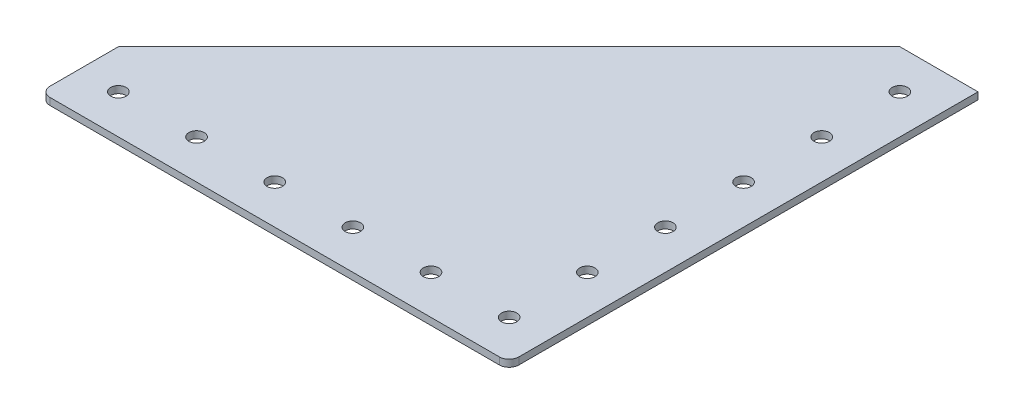
ISO-10303-21;
HEADER;
FILE_DESCRIPTION(('STEP AP214'),'2;1');
FILE_NAME('part.step','',(''),(''),'','','');
FILE_SCHEMA(('AUTOMOTIVE_DESIGN { 1 0 10303 214 1 1 1 1 }'));
ENDSEC;
DATA;
#1=APPLICATION_CONTEXT('core data for automotive mechanical design processes');
#2=APPLICATION_PROTOCOL_DEFINITION('international standard','automotive_design',2000,#1);
#3=PRODUCT_CONTEXT('',#1,'mechanical');
#4=PRODUCT('Part','Part','',(#3));
#5=PRODUCT_RELATED_PRODUCT_CATEGORY('part','',(#4));
#6=PRODUCT_DEFINITION_FORMATION('','',#4);
#7=PRODUCT_DEFINITION_CONTEXT('part definition',#1,'design');
#8=PRODUCT_DEFINITION('design','',#6,#7);
#9=PRODUCT_DEFINITION_SHAPE('','',#8);
#10=(LENGTH_UNIT() NAMED_UNIT(*) SI_UNIT(.MILLI.,.METRE.));
#11=(NAMED_UNIT(*) PLANE_ANGLE_UNIT() SI_UNIT($,.RADIAN.));
#12=(NAMED_UNIT(*) SI_UNIT($,.STERADIAN.) SOLID_ANGLE_UNIT());
#13=UNCERTAINTY_MEASURE_WITH_UNIT(LENGTH_MEASURE(1.E-05),#10,'distance_accuracy_value','');
#14=(GEOMETRIC_REPRESENTATION_CONTEXT(3) GLOBAL_UNCERTAINTY_ASSIGNED_CONTEXT((#13)) GLOBAL_UNIT_ASSIGNED_CONTEXT((#10,
#11,#12)) REPRESENTATION_CONTEXT('',''));
#15=CARTESIAN_POINT('',(0.,0.,0.));
#16=DIRECTION('',(0.,0.,1.));
#17=DIRECTION('',(1.,0.,0.));
#18=AXIS2_PLACEMENT_3D('',#15,#16,#17);
#19=CARTESIAN_POINT('',(0.,1.143,0.));
#20=DIRECTION('',(0.,1.,0.));
#21=DIRECTION('',(0.,0.,1.));
#22=AXIS2_PLACEMENT_3D('',#19,#20,#21);
#23=PLANE('',#22);
#24=CARTESIAN_POINT('',(-139.7,1.143,-12.6999999999921));
#25=DIRECTION('',(0.,1.,0.));
#26=DIRECTION('',(0.,0.,1.));
#27=AXIS2_PLACEMENT_3D('',#24,#25,#26);
#28=CIRCLE('',#27,2.48920000000049);
#29=CARTESIAN_POINT('',(-139.7,1.143,-10.2107999999916));
#30=VERTEX_POINT('',#29);
#31=EDGE_CURVE('E353',#30,#30,#28,.T.);
#32=ORIENTED_EDGE('',*,*,#31,.F.);
#33=EDGE_LOOP('',(#32));
#34=FACE_BOUND('',#33,.T.);
#35=CARTESIAN_POINT('',(-12.7000000000003,1.143,-88.9));
#36=DIRECTION('',(0.,1.,0.));
#37=DIRECTION('',(0.,0.,1.));
#38=AXIS2_PLACEMENT_3D('',#35,#36,#37);
#39=CIRCLE('',#38,2.48919999999999);
#40=CARTESIAN_POINT('',(-12.7000000000003,1.143,-86.4108));
#41=VERTEX_POINT('',#40);
#42=EDGE_CURVE('E372',#41,#41,#39,.T.);
#43=ORIENTED_EDGE('',*,*,#42,.F.);
#44=EDGE_LOOP('',(#43));
#45=FACE_BOUND('',#44,.T.);
#46=CARTESIAN_POINT('',(-12.7000000000001,1.143,-38.1));
#47=DIRECTION('',(0.,1.,0.));
#48=DIRECTION('',(0.,0.,1.));
#49=AXIS2_PLACEMENT_3D('',#46,#47,#48);
#50=CIRCLE('',#49,2.48920000000001);
#51=CARTESIAN_POINT('',(-12.7000000000001,1.143,-35.6108));
#52=VERTEX_POINT('',#51);
#53=EDGE_CURVE('E384',#52,#52,#50,.T.);
#54=ORIENTED_EDGE('',*,*,#53,.F.);
#55=EDGE_LOOP('',(#54));
#56=FACE_BOUND('',#55,.T.);
#57=CARTESIAN_POINT('',(-88.9,1.143,-12.6999999999963));
#58=DIRECTION('',(0.,1.,0.));
#59=DIRECTION('',(0.,0.,1.));
#60=AXIS2_PLACEMENT_3D('',#57,#58,#59);
#61=CIRCLE('',#60,2.48920000000002);
#62=CARTESIAN_POINT('',(-88.9,1.143,-10.2107999999963));
#63=VERTEX_POINT('',#62);
#64=EDGE_CURVE('E396',#63,#63,#61,.T.);
#65=ORIENTED_EDGE('',*,*,#64,.F.);
#66=EDGE_LOOP('',(#65));
#67=FACE_BOUND('',#66,.T.);
#68=CARTESIAN_POINT('',(-38.1,1.143,-12.6999999999988));
#69=DIRECTION('',(0.,1.,0.));
#70=DIRECTION('',(0.,0.,1.));
#71=AXIS2_PLACEMENT_3D('',#68,#69,#70);
#72=CIRCLE('',#71,2.4892);
#73=CARTESIAN_POINT('',(-38.1,1.143,-10.2107999999988));
#74=VERTEX_POINT('',#73);
#75=EDGE_CURVE('E408',#74,#74,#72,.T.);
#76=ORIENTED_EDGE('',*,*,#75,.F.);
#77=EDGE_LOOP('',(#76));
#78=FACE_BOUND('',#77,.T.);
#79=DIRECTION('',(1.,0.,0.));
#80=VECTOR('',#79,1.);
#81=CARTESIAN_POINT('',(-152.4,1.143,0.));
#82=LINE('',#81,#80);
#83=CARTESIAN_POINT('',(-149.225,1.143,0.));
#84=VERTEX_POINT('',#83);
#85=CARTESIAN_POINT('',(-3.17500000000007,1.143,0.));
#86=VERTEX_POINT('',#85);
#87=EDGE_CURVE('E105',#84,#86,#82,.T.);
#88=ORIENTED_EDGE('',*,*,#87,.T.);
#89=CARTESIAN_POINT('',(-3.175,1.143,-3.175));
#90=DIRECTION('',(0.,1.,0.));
#91=DIRECTION('',(0.,0.,1.));
#92=AXIS2_PLACEMENT_3D('',#89,#90,#91);
#93=CIRCLE('',#92,3.175);
#94=CARTESIAN_POINT('',(0.,1.143,-3.175));
#95=VERTEX_POINT('',#94);
#96=EDGE_CURVE('E43',#86,#95,#93,.T.);
#97=ORIENTED_EDGE('',*,*,#96,.T.);
#98=DIRECTION('',(0.,0.,-1.));
#99=VECTOR('',#98,1.);
#100=CARTESIAN_POINT('',(0.,1.143,0.));
#101=LINE('',#100,#99);
#102=CARTESIAN_POINT('',(0.,1.143,-152.4));
#103=VERTEX_POINT('',#102);
#104=EDGE_CURVE('E95',#95,#103,#101,.T.);
#105=ORIENTED_EDGE('',*,*,#104,.T.);
#106=DIRECTION('',(-1.,0.,0.));
#107=VECTOR('',#106,1.);
#108=CARTESIAN_POINT('',(0.,1.143,-152.4));
#109=LINE('',#108,#107);
#110=CARTESIAN_POINT('',(-25.4,1.143,-152.4));
#111=VERTEX_POINT('',#110);
#112=EDGE_CURVE('E99',#103,#111,#109,.T.);
#113=ORIENTED_EDGE('',*,*,#112,.T.);
#114=DIRECTION('',(-0.707106781186548,0.,0.707106781186548));
#115=VECTOR('',#114,1.);
#116=CARTESIAN_POINT('',(-25.4,1.143,-152.4));
#117=LINE('',#116,#115);
#118=CARTESIAN_POINT('',(-152.4,1.143,-25.4));
#119=VERTEX_POINT('',#118);
#120=EDGE_CURVE('E120',#111,#119,#117,.T.);
#121=ORIENTED_EDGE('',*,*,#120,.T.);
#122=DIRECTION('',(0.,0.,1.));
#123=VECTOR('',#122,1.);
#124=CARTESIAN_POINT('',(-152.4,1.143,-25.4));
#125=LINE('',#124,#123);
#126=CARTESIAN_POINT('',(-152.4,1.143,-3.175));
#127=VERTEX_POINT('',#126);
#128=EDGE_CURVE('E122',#119,#127,#125,.T.);
#129=ORIENTED_EDGE('',*,*,#128,.T.);
#130=CARTESIAN_POINT('',(-149.225,1.143,-3.175));
#131=DIRECTION('',(0.,1.,0.));
#132=DIRECTION('',(0.,0.,1.));
#133=AXIS2_PLACEMENT_3D('',#130,#131,#132);
#134=CIRCLE('',#133,3.175);
#135=EDGE_CURVE('E150',#127,#84,#134,.T.);
#136=ORIENTED_EDGE('',*,*,#135,.T.);
#137=EDGE_LOOP('',(#88,#97,#105,#113,#121,#129,#136));
#138=FACE_BOUND('',#137,.T.);
#139=CARTESIAN_POINT('',(-12.7,1.143,-12.7));
#140=DIRECTION('',(0.,1.,0.));
#141=DIRECTION('',(0.,0.,1.));
#142=AXIS2_PLACEMENT_3D('',#139,#140,#141);
#143=CIRCLE('',#142,2.4892);
#144=CARTESIAN_POINT('',(-12.7,1.143,-10.2108));
#145=VERTEX_POINT('',#144);
#146=EDGE_CURVE('E130',#145,#145,#143,.T.);
#147=ORIENTED_EDGE('',*,*,#146,.F.);
#148=EDGE_LOOP('',(#147));
#149=FACE_BOUND('',#148,.T.);
#150=CARTESIAN_POINT('',(-63.5,1.143,-12.6999999999975));
#151=DIRECTION('',(0.,1.,0.));
#152=DIRECTION('',(0.,0.,1.));
#153=AXIS2_PLACEMENT_3D('',#150,#151,#152);
#154=CIRCLE('',#153,2.4892);
#155=CARTESIAN_POINT('',(-63.5,1.143,-10.2107999999975));
#156=VERTEX_POINT('',#155);
#157=EDGE_CURVE('E402',#156,#156,#154,.T.);
#158=ORIENTED_EDGE('',*,*,#157,.F.);
#159=EDGE_LOOP('',(#158));
#160=FACE_BOUND('',#159,.T.);
#161=CARTESIAN_POINT('',(-114.3,1.143,-12.6999999999951));
#162=DIRECTION('',(0.,1.,0.));
#163=DIRECTION('',(0.,0.,1.));
#164=AXIS2_PLACEMENT_3D('',#161,#162,#163);
#165=CIRCLE('',#164,2.4892);
#166=CARTESIAN_POINT('',(-114.3,1.143,-10.2107999999951));
#167=VERTEX_POINT('',#166);
#168=EDGE_CURVE('E390',#167,#167,#165,.T.);
#169=ORIENTED_EDGE('',*,*,#168,.F.);
#170=EDGE_LOOP('',(#169));
#171=FACE_BOUND('',#170,.T.);
#172=CARTESIAN_POINT('',(-12.7000000000002,1.143,-63.5));
#173=DIRECTION('',(0.,1.,0.));
#174=DIRECTION('',(0.,0.,1.));
#175=AXIS2_PLACEMENT_3D('',#172,#173,#174);
#176=CIRCLE('',#175,2.4892);
#177=CARTESIAN_POINT('',(-12.7000000000002,1.143,-61.0108));
#178=VERTEX_POINT('',#177);
#179=EDGE_CURVE('E378',#178,#178,#176,.T.);
#180=ORIENTED_EDGE('',*,*,#179,.F.);
#181=EDGE_LOOP('',(#180));
#182=FACE_BOUND('',#181,.T.);
#183=CARTESIAN_POINT('',(-12.7000000000003,1.143,-114.3));
#184=DIRECTION('',(0.,1.,0.));
#185=DIRECTION('',(0.,0.,1.));
#186=AXIS2_PLACEMENT_3D('',#183,#184,#185);
#187=CIRCLE('',#186,2.48919999999999);
#188=CARTESIAN_POINT('',(-12.7000000000003,1.143,-111.8108));
#189=VERTEX_POINT('',#188);
#190=EDGE_CURVE('E366',#189,#189,#187,.T.);
#191=ORIENTED_EDGE('',*,*,#190,.F.);
#192=EDGE_LOOP('',(#191));
#193=FACE_BOUND('',#192,.T.);
#194=CARTESIAN_POINT('',(-12.7000000000004,1.143,-139.7));
#195=DIRECTION('',(0.,1.,0.));
#196=DIRECTION('',(0.,0.,1.));
#197=AXIS2_PLACEMENT_3D('',#194,#195,#196);
#198=CIRCLE('',#197,2.4892);
#199=CARTESIAN_POINT('',(-12.7000000000004,1.143,-137.2108));
#200=VERTEX_POINT('',#199);
#201=EDGE_CURVE('E357',#200,#200,#198,.T.);
#202=ORIENTED_EDGE('',*,*,#201,.F.);
#203=EDGE_LOOP('',(#202));
#204=FACE_BOUND('',#203,.T.);
#205=ADVANCED_FACE('F35',(#34,#45,#56,#67,#78,#138,#149,#160,#171,#182,#193,#204),#23,.T.);
#206=CARTESIAN_POINT('',(0.,-1.143,0.));
#207=DIRECTION('',(0.,1.,0.));
#208=DIRECTION('',(0.,0.,1.));
#209=AXIS2_PLACEMENT_3D('',#206,#207,#208);
#210=PLANE('',#209);
#211=CARTESIAN_POINT('',(-139.7,-1.143,-12.6999999999921));
#212=DIRECTION('',(0.,1.,0.));
#213=DIRECTION('',(0.,0.,1.));
#214=AXIS2_PLACEMENT_3D('',#211,#212,#213);
#215=CIRCLE('',#214,2.48920000000049);
#216=CARTESIAN_POINT('',(-139.7,-1.143,-10.2107999999916));
#217=VERTEX_POINT('',#216);
#218=EDGE_CURVE('E356',#217,#217,#215,.T.);
#219=ORIENTED_EDGE('',*,*,#218,.T.);
#220=EDGE_LOOP('',(#219));
#221=FACE_BOUND('',#220,.T.);
#222=CARTESIAN_POINT('',(-12.7000000000003,-1.143,-88.9));
#223=DIRECTION('',(0.,1.,0.));
#224=DIRECTION('',(0.,0.,1.));
#225=AXIS2_PLACEMENT_3D('',#222,#223,#224);
#226=CIRCLE('',#225,2.48919999999999);
#227=CARTESIAN_POINT('',(-12.7000000000003,-1.143,-86.4108));
#228=VERTEX_POINT('',#227);
#229=EDGE_CURVE('E369',#228,#228,#226,.T.);
#230=ORIENTED_EDGE('',*,*,#229,.T.);
#231=EDGE_LOOP('',(#230));
#232=FACE_BOUND('',#231,.T.);
#233=CARTESIAN_POINT('',(-12.7000000000001,-1.143,-38.1));
#234=DIRECTION('',(0.,1.,0.));
#235=DIRECTION('',(0.,0.,1.));
#236=AXIS2_PLACEMENT_3D('',#233,#234,#235);
#237=CIRCLE('',#236,2.48920000000001);
#238=CARTESIAN_POINT('',(-12.7000000000001,-1.143,-35.6108));
#239=VERTEX_POINT('',#238);
#240=EDGE_CURVE('E381',#239,#239,#237,.T.);
#241=ORIENTED_EDGE('',*,*,#240,.T.);
#242=EDGE_LOOP('',(#241));
#243=FACE_BOUND('',#242,.T.);
#244=CARTESIAN_POINT('',(-88.9,-1.143,-12.6999999999963));
#245=DIRECTION('',(0.,1.,0.));
#246=DIRECTION('',(0.,0.,1.));
#247=AXIS2_PLACEMENT_3D('',#244,#245,#246);
#248=CIRCLE('',#247,2.48920000000002);
#249=CARTESIAN_POINT('',(-88.9,-1.143,-10.2107999999963));
#250=VERTEX_POINT('',#249);
#251=EDGE_CURVE('E393',#250,#250,#248,.T.);
#252=ORIENTED_EDGE('',*,*,#251,.T.);
#253=EDGE_LOOP('',(#252));
#254=FACE_BOUND('',#253,.T.);
#255=CARTESIAN_POINT('',(-38.1,-1.143,-12.6999999999988));
#256=DIRECTION('',(0.,1.,0.));
#257=DIRECTION('',(0.,0.,1.));
#258=AXIS2_PLACEMENT_3D('',#255,#256,#257);
#259=CIRCLE('',#258,2.4892);
#260=CARTESIAN_POINT('',(-38.1,-1.143,-10.2107999999988));
#261=VERTEX_POINT('',#260);
#262=EDGE_CURVE('E405',#261,#261,#259,.T.);
#263=ORIENTED_EDGE('',*,*,#262,.T.);
#264=EDGE_LOOP('',(#263));
#265=FACE_BOUND('',#264,.T.);
#266=DIRECTION('',(0.,0.,-1.));
#267=VECTOR('',#266,1.);
#268=CARTESIAN_POINT('',(0.,-1.143,0.));
#269=LINE('',#268,#267);
#270=CARTESIAN_POINT('',(0.,-1.143,-3.175));
#271=VERTEX_POINT('',#270);
#272=CARTESIAN_POINT('',(0.,-1.143,-152.4));
#273=VERTEX_POINT('',#272);
#274=EDGE_CURVE('E111',#271,#273,#269,.T.);
#275=ORIENTED_EDGE('',*,*,#274,.F.);
#276=CARTESIAN_POINT('',(-3.175,-1.143,-3.175));
#277=DIRECTION('',(0.,1.,0.));
#278=DIRECTION('',(0.,0.,1.));
#279=AXIS2_PLACEMENT_3D('',#276,#277,#278);
#280=CIRCLE('',#279,3.175);
#281=CARTESIAN_POINT('',(-3.17500000000007,-1.143,0.));
#282=VERTEX_POINT('',#281);
#283=EDGE_CURVE('E144',#271,#282,#280,.F.);
#284=ORIENTED_EDGE('',*,*,#283,.T.);
#285=DIRECTION('',(1.,0.,0.));
#286=VECTOR('',#285,1.);
#287=CARTESIAN_POINT('',(-152.4,-1.143,0.));
#288=LINE('',#287,#286);
#289=CARTESIAN_POINT('',(-149.225,-1.143,0.));
#290=VERTEX_POINT('',#289);
#291=EDGE_CURVE('E128',#290,#282,#288,.T.);
#292=ORIENTED_EDGE('',*,*,#291,.F.);
#293=CARTESIAN_POINT('',(-149.225,-1.143,-3.175));
#294=DIRECTION('',(0.,1.,0.));
#295=DIRECTION('',(0.,0.,1.));
#296=AXIS2_PLACEMENT_3D('',#293,#294,#295);
#297=CIRCLE('',#296,3.175);
#298=CARTESIAN_POINT('',(-152.4,-1.143,-3.175));
#299=VERTEX_POINT('',#298);
#300=EDGE_CURVE('E142',#290,#299,#297,.F.);
#301=ORIENTED_EDGE('',*,*,#300,.T.);
#302=DIRECTION('',(0.,0.,1.));
#303=VECTOR('',#302,1.);
#304=CARTESIAN_POINT('',(-152.4,-1.143,-25.4));
#305=LINE('',#304,#303);
#306=CARTESIAN_POINT('',(-152.4,-1.143,-25.4));
#307=VERTEX_POINT('',#306);
#308=EDGE_CURVE('E136',#307,#299,#305,.T.);
#309=ORIENTED_EDGE('',*,*,#308,.F.);
#310=DIRECTION('',(-0.707106781186548,0.,0.707106781186548));
#311=VECTOR('',#310,1.);
#312=CARTESIAN_POINT('',(-25.4,-1.143,-152.4));
#313=LINE('',#312,#311);
#314=CARTESIAN_POINT('',(-25.4,-1.143,-152.4));
#315=VERTEX_POINT('',#314);
#316=EDGE_CURVE('E134',#315,#307,#313,.T.);
#317=ORIENTED_EDGE('',*,*,#316,.F.);
#318=DIRECTION('',(-1.,0.,0.));
#319=VECTOR('',#318,1.);
#320=CARTESIAN_POINT('',(0.,-1.143,-152.4));
#321=LINE('',#320,#319);
#322=EDGE_CURVE('E132',#273,#315,#321,.T.);
#323=ORIENTED_EDGE('',*,*,#322,.F.);
#324=EDGE_LOOP('',(#275,#284,#292,#301,#309,#317,#323));
#325=FACE_BOUND('',#324,.T.);
#326=CARTESIAN_POINT('',(-12.7,-1.143,-12.7));
#327=DIRECTION('',(0.,1.,0.));
#328=DIRECTION('',(0.,0.,1.));
#329=AXIS2_PLACEMENT_3D('',#326,#327,#328);
#330=CIRCLE('',#329,2.4892);
#331=CARTESIAN_POINT('',(-12.7,-1.143,-10.2108));
#332=VERTEX_POINT('',#331);
#333=EDGE_CURVE('E411',#332,#332,#330,.T.);
#334=ORIENTED_EDGE('',*,*,#333,.T.);
#335=EDGE_LOOP('',(#334));
#336=FACE_BOUND('',#335,.T.);
#337=CARTESIAN_POINT('',(-63.5,-1.143,-12.6999999999975));
#338=DIRECTION('',(0.,1.,0.));
#339=DIRECTION('',(0.,0.,1.));
#340=AXIS2_PLACEMENT_3D('',#337,#338,#339);
#341=CIRCLE('',#340,2.4892);
#342=CARTESIAN_POINT('',(-63.5,-1.143,-10.2107999999975));
#343=VERTEX_POINT('',#342);
#344=EDGE_CURVE('E399',#343,#343,#341,.T.);
#345=ORIENTED_EDGE('',*,*,#344,.T.);
#346=EDGE_LOOP('',(#345));
#347=FACE_BOUND('',#346,.T.);
#348=CARTESIAN_POINT('',(-114.3,-1.143,-12.6999999999951));
#349=DIRECTION('',(0.,1.,0.));
#350=DIRECTION('',(0.,0.,1.));
#351=AXIS2_PLACEMENT_3D('',#348,#349,#350);
#352=CIRCLE('',#351,2.4892);
#353=CARTESIAN_POINT('',(-114.3,-1.143,-10.2107999999951));
#354=VERTEX_POINT('',#353);
#355=EDGE_CURVE('E387',#354,#354,#352,.T.);
#356=ORIENTED_EDGE('',*,*,#355,.T.);
#357=EDGE_LOOP('',(#356));
#358=FACE_BOUND('',#357,.T.);
#359=CARTESIAN_POINT('',(-12.7000000000002,-1.143,-63.5));
#360=DIRECTION('',(0.,1.,0.));
#361=DIRECTION('',(0.,0.,1.));
#362=AXIS2_PLACEMENT_3D('',#359,#360,#361);
#363=CIRCLE('',#362,2.4892);
#364=CARTESIAN_POINT('',(-12.7000000000002,-1.143,-61.0108));
#365=VERTEX_POINT('',#364);
#366=EDGE_CURVE('E375',#365,#365,#363,.T.);
#367=ORIENTED_EDGE('',*,*,#366,.T.);
#368=EDGE_LOOP('',(#367));
#369=FACE_BOUND('',#368,.T.);
#370=CARTESIAN_POINT('',(-12.7000000000003,-1.143,-114.3));
#371=DIRECTION('',(0.,1.,0.));
#372=DIRECTION('',(0.,0.,1.));
#373=AXIS2_PLACEMENT_3D('',#370,#371,#372);
#374=CIRCLE('',#373,2.48919999999999);
#375=CARTESIAN_POINT('',(-12.7000000000003,-1.143,-111.8108));
#376=VERTEX_POINT('',#375);
#377=EDGE_CURVE('E359',#376,#376,#374,.T.);
#378=ORIENTED_EDGE('',*,*,#377,.T.);
#379=EDGE_LOOP('',(#378));
#380=FACE_BOUND('',#379,.T.);
#381=CARTESIAN_POINT('',(-12.7000000000004,-1.143,-139.7));
#382=DIRECTION('',(0.,1.,0.));
#383=DIRECTION('',(0.,0.,1.));
#384=AXIS2_PLACEMENT_3D('',#381,#382,#383);
#385=CIRCLE('',#384,2.4892);
#386=CARTESIAN_POINT('',(-12.7000000000004,-1.143,-137.2108));
#387=VERTEX_POINT('',#386);
#388=EDGE_CURVE('E362',#387,#387,#385,.T.);
#389=ORIENTED_EDGE('',*,*,#388,.T.);
#390=EDGE_LOOP('',(#389));
#391=FACE_BOUND('',#390,.T.);
#392=ADVANCED_FACE('F158',(#221,#232,#243,#254,#265,#325,#336,#347,#358,#369,#380,#391),#210,.F.);
#393=CARTESIAN_POINT('',(-152.4,1.143,0.));
#394=DIRECTION('',(0.,0.,-1.));
#395=DIRECTION('',(-1.,0.,0.));
#396=AXIS2_PLACEMENT_3D('',#393,#394,#395);
#397=PLANE('',#396);
#398=ORIENTED_EDGE('',*,*,#291,.T.);
#399=DIRECTION('',(0.,-1.,0.));
#400=VECTOR('',#399,1.);
#401=CARTESIAN_POINT('',(-3.17500000000001,1.143,0.));
#402=LINE('',#401,#400);
#403=EDGE_CURVE('E56',#282,#86,#402,.F.);
#404=ORIENTED_EDGE('',*,*,#403,.T.);
#405=ORIENTED_EDGE('',*,*,#87,.F.);
#406=DIRECTION('',(0.,-1.,0.));
#407=VECTOR('',#406,1.);
#408=CARTESIAN_POINT('',(-149.225,1.143,0.));
#409=LINE('',#408,#407);
#410=EDGE_CURVE('E146',#84,#290,#409,.T.);
#411=ORIENTED_EDGE('',*,*,#410,.T.);
#412=EDGE_LOOP('',(#398,#404,#405,#411));
#413=FACE_BOUND('',#412,.T.);
#414=ADVANCED_FACE('F154',(#413),#397,.F.);
#415=CARTESIAN_POINT('',(0.,1.143,0.));
#416=DIRECTION('',(-1.,0.,0.));
#417=DIRECTION('',(0.,0.,1.));
#418=AXIS2_PLACEMENT_3D('',#415,#416,#417);
#419=PLANE('',#418);
#420=ORIENTED_EDGE('',*,*,#104,.F.);
#421=DIRECTION('',(0.,-1.,0.));
#422=VECTOR('',#421,1.);
#423=CARTESIAN_POINT('',(0.,1.143,-3.175));
#424=LINE('',#423,#422);
#425=EDGE_CURVE('E114',#95,#271,#424,.T.);
#426=ORIENTED_EDGE('',*,*,#425,.T.);
#427=ORIENTED_EDGE('',*,*,#274,.T.);
#428=DIRECTION('',(0.,-1.,0.));
#429=VECTOR('',#428,1.);
#430=CARTESIAN_POINT('',(0.,1.143,-152.4));
#431=LINE('',#430,#429);
#432=EDGE_CURVE('E108',#103,#273,#431,.T.);
#433=ORIENTED_EDGE('',*,*,#432,.F.);
#434=EDGE_LOOP('',(#420,#426,#427,#433));
#435=FACE_BOUND('',#434,.T.);
#436=ADVANCED_FACE('F109',(#435),#419,.F.);
#437=CARTESIAN_POINT('',(0.,1.143,-152.4));
#438=DIRECTION('',(0.,0.,1.));
#439=DIRECTION('',(1.,0.,0.));
#440=AXIS2_PLACEMENT_3D('',#437,#438,#439);
#441=PLANE('',#440);
#442=ORIENTED_EDGE('',*,*,#322,.T.);
#443=DIRECTION('',(0.,-1.,0.));
#444=VECTOR('',#443,1.);
#445=CARTESIAN_POINT('',(-25.4,1.143,-152.4));
#446=LINE('',#445,#444);
#447=EDGE_CURVE('E115',#111,#315,#446,.T.);
#448=ORIENTED_EDGE('',*,*,#447,.F.);
#449=ORIENTED_EDGE('',*,*,#112,.F.);
#450=ORIENTED_EDGE('',*,*,#432,.T.);
#451=EDGE_LOOP('',(#442,#448,#449,#450));
#452=FACE_BOUND('',#451,.T.);
#453=ADVANCED_FACE('F117',(#452),#441,.F.);
#454=CARTESIAN_POINT('',(-25.4,1.143,-152.4));
#455=DIRECTION('',(0.707106781186548,0.,0.707106781186548));
#456=DIRECTION('',(0.707106781186548,0.,-0.707106781186548));
#457=AXIS2_PLACEMENT_3D('',#454,#455,#456);
#458=PLANE('',#457);
#459=ORIENTED_EDGE('',*,*,#316,.T.);
#460=DIRECTION('',(0.,-1.,0.));
#461=VECTOR('',#460,1.);
#462=CARTESIAN_POINT('',(-152.4,1.143,-25.4));
#463=LINE('',#462,#461);
#464=EDGE_CURVE('E127',#119,#307,#463,.T.);
#465=ORIENTED_EDGE('',*,*,#464,.F.);
#466=ORIENTED_EDGE('',*,*,#120,.F.);
#467=ORIENTED_EDGE('',*,*,#447,.T.);
#468=EDGE_LOOP('',(#459,#465,#466,#467));
#469=FACE_BOUND('',#468,.T.);
#470=ADVANCED_FACE('F164',(#469),#458,.F.);
#471=CARTESIAN_POINT('',(-152.4,1.143,-25.4));
#472=DIRECTION('',(1.,0.,0.));
#473=DIRECTION('',(0.,0.,-1.));
#474=AXIS2_PLACEMENT_3D('',#471,#472,#473);
#475=PLANE('',#474);
#476=ORIENTED_EDGE('',*,*,#308,.T.);
#477=DIRECTION('',(0.,-1.,0.));
#478=VECTOR('',#477,1.);
#479=CARTESIAN_POINT('',(-152.4,1.143,-3.175));
#480=LINE('',#479,#478);
#481=EDGE_CURVE('E11',#299,#127,#480,.F.);
#482=ORIENTED_EDGE('',*,*,#481,.T.);
#483=ORIENTED_EDGE('',*,*,#128,.F.);
#484=ORIENTED_EDGE('',*,*,#464,.T.);
#485=EDGE_LOOP('',(#476,#482,#483,#484));
#486=FACE_BOUND('',#485,.T.);
#487=ADVANCED_FACE('F161',(#486),#475,.F.);
#488=CARTESIAN_POINT('',(-12.7,1.143,-12.7));
#489=DIRECTION('',(0.,-1.,0.));
#490=DIRECTION('',(0.,0.,-1.));
#491=AXIS2_PLACEMENT_3D('',#488,#489,#490);
#492=CYLINDRICAL_SURFACE('',#491,2.4892);
#493=ORIENTED_EDGE('',*,*,#146,.T.);
#494=EDGE_LOOP('',(#493));
#495=FACE_BOUND('',#494,.T.);
#496=ORIENTED_EDGE('',*,*,#333,.F.);
#497=EDGE_LOOP('',(#496));
#498=FACE_BOUND('',#497,.T.);
#499=ADVANCED_FACE('F188',(#495,#498),#492,.F.);
#500=CARTESIAN_POINT('',(-38.1,1.143,-12.6999999999988));
#501=DIRECTION('',(0.,-1.,0.));
#502=DIRECTION('',(0.,0.,-1.));
#503=AXIS2_PLACEMENT_3D('',#500,#501,#502);
#504=CYLINDRICAL_SURFACE('',#503,2.4892);
#505=ORIENTED_EDGE('',*,*,#75,.T.);
#506=EDGE_LOOP('',(#505));
#507=FACE_BOUND('',#506,.T.);
#508=ORIENTED_EDGE('',*,*,#262,.F.);
#509=EDGE_LOOP('',(#508));
#510=FACE_BOUND('',#509,.T.);
#511=ADVANCED_FACE('F225',(#507,#510),#504,.F.);
#512=CARTESIAN_POINT('',(-63.5,1.143,-12.6999999999975));
#513=DIRECTION('',(0.,-1.,0.));
#514=DIRECTION('',(0.,0.,-1.));
#515=AXIS2_PLACEMENT_3D('',#512,#513,#514);
#516=CYLINDRICAL_SURFACE('',#515,2.4892);
#517=ORIENTED_EDGE('',*,*,#157,.T.);
#518=EDGE_LOOP('',(#517));
#519=FACE_BOUND('',#518,.T.);
#520=ORIENTED_EDGE('',*,*,#344,.F.);
#521=EDGE_LOOP('',(#520));
#522=FACE_BOUND('',#521,.T.);
#523=ADVANCED_FACE('F232',(#519,#522),#516,.F.);
#524=CARTESIAN_POINT('',(-88.9,1.143,-12.6999999999963));
#525=DIRECTION('',(0.,-1.,0.));
#526=DIRECTION('',(0.,0.,-1.));
#527=AXIS2_PLACEMENT_3D('',#524,#525,#526);
#528=CYLINDRICAL_SURFACE('',#527,2.48920000000002);
#529=ORIENTED_EDGE('',*,*,#64,.T.);
#530=EDGE_LOOP('',(#529));
#531=FACE_BOUND('',#530,.T.);
#532=ORIENTED_EDGE('',*,*,#251,.F.);
#533=EDGE_LOOP('',(#532));
#534=FACE_BOUND('',#533,.T.);
#535=ADVANCED_FACE('F239',(#531,#534),#528,.F.);
#536=CARTESIAN_POINT('',(-114.3,1.143,-12.6999999999951));
#537=DIRECTION('',(0.,-1.,0.));
#538=DIRECTION('',(0.,0.,-1.));
#539=AXIS2_PLACEMENT_3D('',#536,#537,#538);
#540=CYLINDRICAL_SURFACE('',#539,2.4892);
#541=ORIENTED_EDGE('',*,*,#168,.T.);
#542=EDGE_LOOP('',(#541));
#543=FACE_BOUND('',#542,.T.);
#544=ORIENTED_EDGE('',*,*,#355,.F.);
#545=EDGE_LOOP('',(#544));
#546=FACE_BOUND('',#545,.T.);
#547=ADVANCED_FACE('F247',(#543,#546),#540,.F.);
#548=CARTESIAN_POINT('',(-12.7000000000001,1.143,-38.1));
#549=DIRECTION('',(0.,-1.,0.));
#550=DIRECTION('',(0.,0.,-1.));
#551=AXIS2_PLACEMENT_3D('',#548,#549,#550);
#552=CYLINDRICAL_SURFACE('',#551,2.48920000000001);
#553=ORIENTED_EDGE('',*,*,#53,.T.);
#554=EDGE_LOOP('',(#553));
#555=FACE_BOUND('',#554,.T.);
#556=ORIENTED_EDGE('',*,*,#240,.F.);
#557=EDGE_LOOP('',(#556));
#558=FACE_BOUND('',#557,.T.);
#559=ADVANCED_FACE('F255',(#555,#558),#552,.F.);
#560=CARTESIAN_POINT('',(-12.7000000000002,1.143,-63.5));
#561=DIRECTION('',(0.,-1.,0.));
#562=DIRECTION('',(0.,0.,-1.));
#563=AXIS2_PLACEMENT_3D('',#560,#561,#562);
#564=CYLINDRICAL_SURFACE('',#563,2.4892);
#565=ORIENTED_EDGE('',*,*,#179,.T.);
#566=EDGE_LOOP('',(#565));
#567=FACE_BOUND('',#566,.T.);
#568=ORIENTED_EDGE('',*,*,#366,.F.);
#569=EDGE_LOOP('',(#568));
#570=FACE_BOUND('',#569,.T.);
#571=ADVANCED_FACE('F263',(#567,#570),#564,.F.);
#572=CARTESIAN_POINT('',(-12.7000000000003,1.143,-88.9));
#573=DIRECTION('',(0.,-1.,0.));
#574=DIRECTION('',(0.,0.,-1.));
#575=AXIS2_PLACEMENT_3D('',#572,#573,#574);
#576=CYLINDRICAL_SURFACE('',#575,2.48919999999999);
#577=ORIENTED_EDGE('',*,*,#42,.T.);
#578=EDGE_LOOP('',(#577));
#579=FACE_BOUND('',#578,.T.);
#580=ORIENTED_EDGE('',*,*,#229,.F.);
#581=EDGE_LOOP('',(#580));
#582=FACE_BOUND('',#581,.T.);
#583=ADVANCED_FACE('F271',(#579,#582),#576,.F.);
#584=CARTESIAN_POINT('',(-12.7000000000003,1.143,-114.3));
#585=DIRECTION('',(0.,-1.,0.));
#586=DIRECTION('',(0.,0.,-1.));
#587=AXIS2_PLACEMENT_3D('',#584,#585,#586);
#588=CYLINDRICAL_SURFACE('',#587,2.48919999999999);
#589=ORIENTED_EDGE('',*,*,#190,.T.);
#590=EDGE_LOOP('',(#589));
#591=FACE_BOUND('',#590,.T.);
#592=ORIENTED_EDGE('',*,*,#377,.F.);
#593=EDGE_LOOP('',(#592));
#594=FACE_BOUND('',#593,.T.);
#595=ADVANCED_FACE('F279',(#591,#594),#588,.F.);
#596=CARTESIAN_POINT('',(-139.7,1.143,-12.6999999999921));
#597=DIRECTION('',(0.,-1.,0.));
#598=DIRECTION('',(0.,0.,-1.));
#599=AXIS2_PLACEMENT_3D('',#596,#597,#598);
#600=CYLINDRICAL_SURFACE('',#599,2.48920000000049);
#601=ORIENTED_EDGE('',*,*,#31,.T.);
#602=EDGE_LOOP('',(#601));
#603=FACE_BOUND('',#602,.T.);
#604=ORIENTED_EDGE('',*,*,#218,.F.);
#605=EDGE_LOOP('',(#604));
#606=FACE_BOUND('',#605,.T.);
#607=ADVANCED_FACE('F173',(#603,#606),#600,.F.);
#608=CARTESIAN_POINT('',(-12.7000000000004,1.143,-139.7));
#609=DIRECTION('',(0.,-1.,0.));
#610=DIRECTION('',(0.,0.,-1.));
#611=AXIS2_PLACEMENT_3D('',#608,#609,#610);
#612=CYLINDRICAL_SURFACE('',#611,2.4892);
#613=ORIENTED_EDGE('',*,*,#201,.T.);
#614=EDGE_LOOP('',(#613));
#615=FACE_BOUND('',#614,.T.);
#616=ORIENTED_EDGE('',*,*,#388,.F.);
#617=EDGE_LOOP('',(#616));
#618=FACE_BOUND('',#617,.T.);
#619=ADVANCED_FACE('F168',(#615,#618),#612,.F.);
#620=CARTESIAN_POINT('',(-3.175,1.143,-3.175));
#621=DIRECTION('',(0.,-1.,0.));
#622=DIRECTION('',(0.,0.,-1.));
#623=AXIS2_PLACEMENT_3D('',#620,#621,#622);
#624=CYLINDRICAL_SURFACE('',#623,3.175);
#625=ORIENTED_EDGE('',*,*,#96,.F.);
#626=ORIENTED_EDGE('',*,*,#403,.F.);
#627=ORIENTED_EDGE('',*,*,#283,.F.);
#628=ORIENTED_EDGE('',*,*,#425,.F.);
#629=EDGE_LOOP('',(#625,#626,#627,#628));
#630=FACE_BOUND('',#629,.T.);
#631=ADVANCED_FACE('F166',(#630),#624,.T.);
#632=CARTESIAN_POINT('',(-149.225,1.143,-3.175));
#633=DIRECTION('',(0.,-1.,0.));
#634=DIRECTION('',(0.,0.,-1.));
#635=AXIS2_PLACEMENT_3D('',#632,#633,#634);
#636=CYLINDRICAL_SURFACE('',#635,3.175);
#637=ORIENTED_EDGE('',*,*,#135,.F.);
#638=ORIENTED_EDGE('',*,*,#481,.F.);
#639=ORIENTED_EDGE('',*,*,#300,.F.);
#640=ORIENTED_EDGE('',*,*,#410,.F.);
#641=EDGE_LOOP('',(#637,#638,#639,#640));
#642=FACE_BOUND('',#641,.T.);
#643=ADVANCED_FACE('F37',(#642),#636,.T.);
#644=CLOSED_SHELL('',(#205,#392,#414,#436,#453,#470,#487,#499,#511,#523,#535,#547,#559,#571,
#583,#595,#607,#619,#631,#643));
#645=MANIFOLD_SOLID_BREP('B2',#644);
#646=ADVANCED_BREP_SHAPE_REPRESENTATION('',(#18,#645),#14);
#647=SHAPE_DEFINITION_REPRESENTATION(#9,#646);
ENDSEC;
END-ISO-10303-21;
